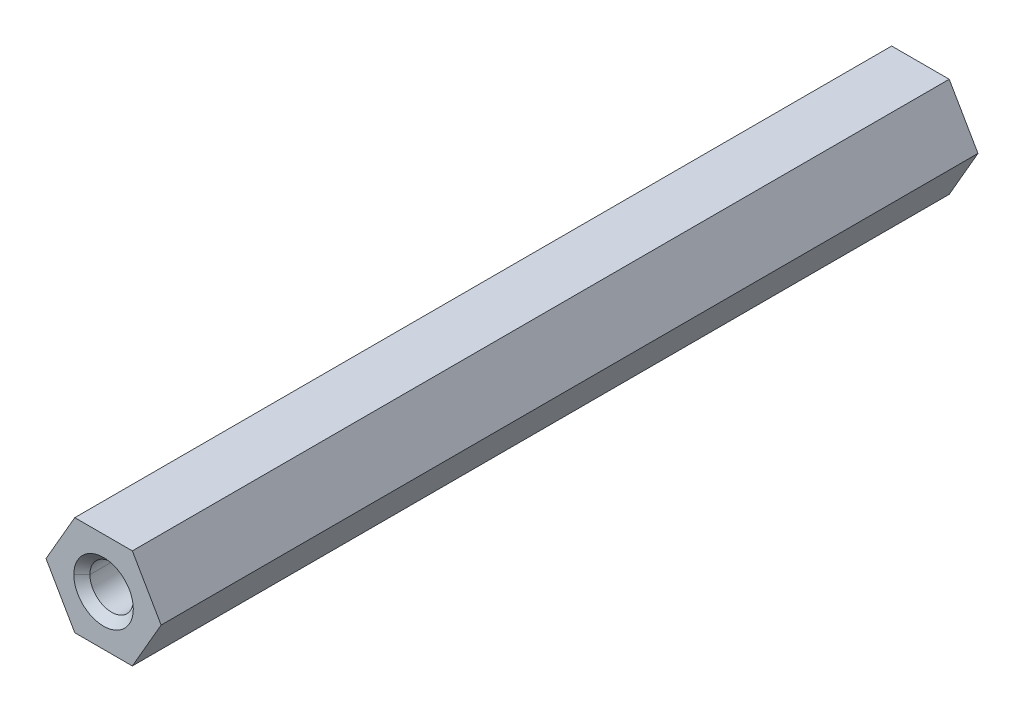
ISO-10303-21;
HEADER;
FILE_DESCRIPTION(('STEP AP214'),'2;1');
FILE_NAME('part.step','',(''),(''),'','','');
FILE_SCHEMA(('AUTOMOTIVE_DESIGN { 1 0 10303 214 1 1 1 1 }'));
ENDSEC;
DATA;
#1=APPLICATION_CONTEXT('core data for automotive mechanical design processes');
#2=APPLICATION_PROTOCOL_DEFINITION('international standard','automotive_design',2000,#1);
#3=PRODUCT_CONTEXT('',#1,'mechanical');
#4=PRODUCT('Part','Part','',(#3));
#5=PRODUCT_RELATED_PRODUCT_CATEGORY('part','',(#4));
#6=PRODUCT_DEFINITION_FORMATION('','',#4);
#7=PRODUCT_DEFINITION_CONTEXT('part definition',#1,'design');
#8=PRODUCT_DEFINITION('design','',#6,#7);
#9=PRODUCT_DEFINITION_SHAPE('','',#8);
#10=(LENGTH_UNIT() NAMED_UNIT(*) SI_UNIT(.MILLI.,.METRE.));
#11=(NAMED_UNIT(*) PLANE_ANGLE_UNIT() SI_UNIT($,.RADIAN.));
#12=(NAMED_UNIT(*) SI_UNIT($,.STERADIAN.) SOLID_ANGLE_UNIT());
#13=UNCERTAINTY_MEASURE_WITH_UNIT(LENGTH_MEASURE(1.E-05),#10,'distance_accuracy_value','');
#14=(GEOMETRIC_REPRESENTATION_CONTEXT(3) GLOBAL_UNCERTAINTY_ASSIGNED_CONTEXT((#13)) GLOBAL_UNIT_ASSIGNED_CONTEXT((#10,
#11,#12)) REPRESENTATION_CONTEXT('',''));
#15=CARTESIAN_POINT('',(0.,0.,0.));
#16=DIRECTION('',(0.,0.,1.));
#17=DIRECTION('',(1.,0.,0.));
#18=AXIS2_PLACEMENT_3D('',#15,#16,#17);
#19=CARTESIAN_POINT('',(-1.62454908752352,-14.8840979144325,35.8692888654536));
#20=DIRECTION('',(0.,0.,1.));
#21=DIRECTION('',(1.,0.,0.));
#22=AXIS2_PLACEMENT_3D('',#19,#20,#21);
#23=CONICAL_SURFACE('',#22,1.35,0.785398163397452);
#24=DIRECTION('',(-0.707106781186551,0.,0.707106781186545));
#25=VECTOR('',#24,1.);
#26=CARTESIAN_POINT('',(-2.97454908752352,-14.8840979144325,35.8692888654536));
#27=LINE('',#26,#25);
#28=CARTESIAN_POINT('',(-2.97454908752352,-14.8840979144325,35.8692888654536));
#29=VERTEX_POINT('',#28);
#30=CARTESIAN_POINT('',(-3.47454908752353,-14.8840979144325,36.3692888654536));
#31=VERTEX_POINT('',#30);
#32=EDGE_CURVE('E236',#29,#31,#27,.T.);
#33=ORIENTED_EDGE('',*,*,#32,.F.);
#34=CARTESIAN_POINT('',(-1.62454908752352,-14.8840979144325,35.8692888654536));
#35=DIRECTION('',(0.,0.,1.));
#36=DIRECTION('',(-1.,0.,0.));
#37=AXIS2_PLACEMENT_3D('',#34,#35,#36);
#38=CIRCLE('',#37,1.35);
#39=CARTESIAN_POINT('',(-0.274549087523519,-14.8840979144325,35.8692888654536));
#40=VERTEX_POINT('',#39);
#41=EDGE_CURVE('E9',#40,#29,#38,.T.);
#42=ORIENTED_EDGE('',*,*,#41,.F.);
#43=DIRECTION('',(0.707106781186551,0.,0.707106781186545));
#44=VECTOR('',#43,1.);
#45=CARTESIAN_POINT('',(-0.274549087523519,-14.8840979144325,35.8692888654536));
#46=LINE('',#45,#44);
#47=CARTESIAN_POINT('',(0.225450912476485,-14.8840979144325,36.3692888654536));
#48=VERTEX_POINT('',#47);
#49=EDGE_CURVE('E179',#40,#48,#46,.T.);
#50=ORIENTED_EDGE('',*,*,#49,.T.);
#51=CARTESIAN_POINT('',(-1.62454908752352,-14.8840979144325,36.3692888654536));
#52=DIRECTION('',(0.,0.,-1.));
#53=DIRECTION('',(-1.,0.,0.));
#54=AXIS2_PLACEMENT_3D('',#51,#52,#53);
#55=CIRCLE('',#54,1.85);
#56=EDGE_CURVE('E160',#31,#48,#55,.T.);
#57=ORIENTED_EDGE('',*,*,#56,.F.);
#58=EDGE_LOOP('',(#33,#42,#50,#57));
#59=FACE_BOUND('',#58,.T.);
#60=ADVANCED_FACE('F14',(#59),#23,.F.);
#61=CARTESIAN_POINT('',(-1.62454908752352,-14.8840979144325,-14.4307111345464));
#62=DIRECTION('',(0.,0.,-1.));
#63=DIRECTION('',(-1.,0.,0.));
#64=AXIS2_PLACEMENT_3D('',#61,#62,#63);
#65=CONICAL_SURFACE('',#64,1.85,0.785398163397445);
#66=DIRECTION('',(0.707106781186545,0.,-0.70710678118655));
#67=VECTOR('',#66,1.);
#68=CARTESIAN_POINT('',(0.225450912476485,-14.8840979144325,-14.4307111345464));
#69=LINE('',#68,#67);
#70=CARTESIAN_POINT('',(-0.274549087523519,-14.8840979144325,-13.9307111345464));
#71=VERTEX_POINT('',#70);
#72=CARTESIAN_POINT('',(0.225450912476485,-14.8840979144325,-14.4307111345464));
#73=VERTEX_POINT('',#72);
#74=EDGE_CURVE('E154',#71,#73,#69,.T.);
#75=ORIENTED_EDGE('',*,*,#74,.F.);
#76=CARTESIAN_POINT('',(-1.62454908752352,-14.8840979144325,-13.9307111345464));
#77=DIRECTION('',(0.,0.,-1.));
#78=DIRECTION('',(-1.,0.,0.));
#79=AXIS2_PLACEMENT_3D('',#76,#77,#78);
#80=CIRCLE('',#79,1.35);
#81=CARTESIAN_POINT('',(-2.97454908752352,-14.8840979144325,-13.9307111345464));
#82=VERTEX_POINT('',#81);
#83=EDGE_CURVE('E25',#82,#71,#80,.T.);
#84=ORIENTED_EDGE('',*,*,#83,.F.);
#85=DIRECTION('',(-0.707106781186545,0.,-0.70710678118655));
#86=VECTOR('',#85,1.);
#87=CARTESIAN_POINT('',(-3.47454908752353,-14.8840979144325,-14.4307111345464));
#88=LINE('',#87,#86);
#89=CARTESIAN_POINT('',(-3.47454908752353,-14.8840979144325,-14.4307111345464));
#90=VERTEX_POINT('',#89);
#91=EDGE_CURVE('E151',#82,#90,#88,.T.);
#92=ORIENTED_EDGE('',*,*,#91,.T.);
#93=CARTESIAN_POINT('',(-1.62454908752352,-14.8840979144325,-14.4307111345464));
#94=DIRECTION('',(0.,0.,1.));
#95=DIRECTION('',(-1.,0.,0.));
#96=AXIS2_PLACEMENT_3D('',#93,#94,#95);
#97=CIRCLE('',#96,1.85);
#98=EDGE_CURVE('E143',#73,#90,#97,.T.);
#99=ORIENTED_EDGE('',*,*,#98,.F.);
#100=EDGE_LOOP('',(#75,#84,#92,#99));
#101=FACE_BOUND('',#100,.T.);
#102=ADVANCED_FACE('F149',(#101),#65,.F.);
#103=CARTESIAN_POINT('',(-1.62454908752352,-14.8840979144325,-14.4307111345464));
#104=DIRECTION('',(0.,0.,1.));
#105=DIRECTION('',(1.,0.,0.));
#106=AXIS2_PLACEMENT_3D('',#103,#104,#105);
#107=CYLINDRICAL_SURFACE('',#106,1.35);
#108=DIRECTION('',(0.,0.,1.));
#109=VECTOR('',#108,1.);
#110=CARTESIAN_POINT('',(-2.97454908752352,-14.8840979144325,-14.4307111345464));
#111=LINE('',#110,#109);
#112=EDGE_CURVE('E163',#82,#29,#111,.T.);
#113=ORIENTED_EDGE('',*,*,#112,.F.);
#114=ORIENTED_EDGE('',*,*,#83,.T.);
#115=DIRECTION('',(0.,0.,1.));
#116=VECTOR('',#115,1.);
#117=CARTESIAN_POINT('',(-0.274549087523519,-14.8840979144325,-14.4307111345464));
#118=LINE('',#117,#116);
#119=EDGE_CURVE('E169',#71,#40,#118,.T.);
#120=ORIENTED_EDGE('',*,*,#119,.T.);
#121=ORIENTED_EDGE('',*,*,#41,.T.);
#122=EDGE_LOOP('',(#113,#114,#120,#121));
#123=FACE_BOUND('',#122,.T.);
#124=ADVANCED_FACE('F16',(#123),#107,.F.);
#125=CARTESIAN_POINT('',(-1.62454908752352,-21.0840979144324,36.3692888654536));
#126=DIRECTION('',(0.,0.,-1.));
#127=DIRECTION('',(0.,-1.,0.));
#128=AXIS2_PLACEMENT_3D('',#125,#126,#127);
#129=PLANE('',#128);
#130=CARTESIAN_POINT('',(-1.62454908752352,-14.8840979144325,36.3692888654536));
#131=DIRECTION('',(0.,0.,-1.));
#132=DIRECTION('',(-1.,0.,0.));
#133=AXIS2_PLACEMENT_3D('',#130,#131,#132);
#134=CIRCLE('',#133,1.85);
#135=EDGE_CURVE('E188',#48,#31,#134,.T.);
#136=ORIENTED_EDGE('',*,*,#135,.T.);
#137=ORIENTED_EDGE('',*,*,#56,.T.);
#138=EDGE_LOOP('',(#136,#137));
#139=FACE_BOUND('',#138,.T.);
#140=DIRECTION('',(0.5,0.866025403784439,0.));
#141=VECTOR('',#140,1.);
#142=CARTESIAN_POINT('',(0.165236746964321,-17.9840979144324,36.3692888654536));
#143=LINE('',#142,#141);
#144=CARTESIAN_POINT('',(0.165236746964321,-17.9840979144324,36.3692888654536));
#145=VERTEX_POINT('',#144);
#146=CARTESIAN_POINT('',(1.95502258145217,-14.8840979144325,36.3692888654536));
#147=VERTEX_POINT('',#146);
#148=EDGE_CURVE('E232',#145,#147,#143,.T.);
#149=ORIENTED_EDGE('',*,*,#148,.T.);
#150=DIRECTION('',(-0.5,0.866025403784439,0.));
#151=VECTOR('',#150,1.);
#152=CARTESIAN_POINT('',(1.95502258145217,-14.8840979144325,36.3692888654536));
#153=LINE('',#152,#151);
#154=CARTESIAN_POINT('',(0.165236746964321,-11.7840979144325,36.3692888654536));
#155=VERTEX_POINT('',#154);
#156=EDGE_CURVE('E250',#147,#155,#153,.T.);
#157=ORIENTED_EDGE('',*,*,#156,.T.);
#158=DIRECTION('',(-1.,0.,0.));
#159=VECTOR('',#158,1.);
#160=CARTESIAN_POINT('',(0.165236746964321,-11.7840979144325,36.3692888654536));
#161=LINE('',#160,#159);
#162=CARTESIAN_POINT('',(-3.41433492201136,-11.7840979144325,36.3692888654536));
#163=VERTEX_POINT('',#162);
#164=EDGE_CURVE('E111',#155,#163,#161,.T.);
#165=ORIENTED_EDGE('',*,*,#164,.T.);
#166=DIRECTION('',(-0.5,-0.866025403784439,0.));
#167=VECTOR('',#166,1.);
#168=CARTESIAN_POINT('',(-3.41433492201136,-11.7840979144325,36.3692888654536));
#169=LINE('',#168,#167);
#170=CARTESIAN_POINT('',(-5.2041207564992,-14.8840979144325,36.3692888654536));
#171=VERTEX_POINT('',#170);
#172=EDGE_CURVE('E127',#163,#171,#169,.T.);
#173=ORIENTED_EDGE('',*,*,#172,.T.);
#174=DIRECTION('',(0.5,-0.866025403784439,0.));
#175=VECTOR('',#174,1.);
#176=CARTESIAN_POINT('',(-5.2041207564992,-14.8840979144325,36.3692888654536));
#177=LINE('',#176,#175);
#178=CARTESIAN_POINT('',(-3.41433492201136,-17.9840979144324,36.3692888654536));
#179=VERTEX_POINT('',#178);
#180=EDGE_CURVE('E216',#171,#179,#177,.T.);
#181=ORIENTED_EDGE('',*,*,#180,.T.);
#182=DIRECTION('',(1.,0.,0.));
#183=VECTOR('',#182,1.);
#184=CARTESIAN_POINT('',(-3.41433492201136,-17.9840979144324,36.3692888654536));
#185=LINE('',#184,#183);
#186=EDGE_CURVE('E198',#179,#145,#185,.T.);
#187=ORIENTED_EDGE('',*,*,#186,.T.);
#188=EDGE_LOOP('',(#149,#157,#165,#173,#181,#187));
#189=FACE_BOUND('',#188,.T.);
#190=ADVANCED_FACE('F311',(#139,#189),#129,.F.);
#191=CARTESIAN_POINT('',(-1.62454908752352,-21.0840979144324,-14.4307111345464));
#192=DIRECTION('',(0.,0.,-1.));
#193=DIRECTION('',(0.,-1.,0.));
#194=AXIS2_PLACEMENT_3D('',#191,#192,#193);
#195=PLANE('',#194);
#196=CARTESIAN_POINT('',(-1.62454908752352,-14.8840979144325,-14.4307111345464));
#197=DIRECTION('',(0.,0.,1.));
#198=DIRECTION('',(-1.,0.,0.));
#199=AXIS2_PLACEMENT_3D('',#196,#197,#198);
#200=CIRCLE('',#199,1.85);
#201=EDGE_CURVE('E174',#90,#73,#200,.T.);
#202=ORIENTED_EDGE('',*,*,#201,.T.);
#203=ORIENTED_EDGE('',*,*,#98,.T.);
#204=EDGE_LOOP('',(#202,#203));
#205=FACE_BOUND('',#204,.T.);
#206=DIRECTION('',(0.5,0.866025403784439,0.));
#207=VECTOR('',#206,1.);
#208=CARTESIAN_POINT('',(0.165236746964321,-17.9840979144324,-14.4307111345464));
#209=LINE('',#208,#207);
#210=CARTESIAN_POINT('',(0.165236746964321,-17.9840979144324,-14.4307111345464));
#211=VERTEX_POINT('',#210);
#212=CARTESIAN_POINT('',(1.95502258145217,-14.8840979144325,-14.4307111345464));
#213=VERTEX_POINT('',#212);
#214=EDGE_CURVE('E201',#211,#213,#209,.T.);
#215=ORIENTED_EDGE('',*,*,#214,.F.);
#216=DIRECTION('',(1.,0.,0.));
#217=VECTOR('',#216,1.);
#218=CARTESIAN_POINT('',(-3.41433492201136,-17.9840979144324,-14.4307111345464));
#219=LINE('',#218,#217);
#220=CARTESIAN_POINT('',(-3.41433492201136,-17.9840979144324,-14.4307111345464));
#221=VERTEX_POINT('',#220);
#222=EDGE_CURVE('E96',#221,#211,#219,.T.);
#223=ORIENTED_EDGE('',*,*,#222,.F.);
#224=DIRECTION('',(0.5,-0.866025403784439,0.));
#225=VECTOR('',#224,1.);
#226=CARTESIAN_POINT('',(-5.2041207564992,-14.8840979144325,-14.4307111345464));
#227=LINE('',#226,#225);
#228=CARTESIAN_POINT('',(-5.2041207564992,-14.8840979144325,-14.4307111345464));
#229=VERTEX_POINT('',#228);
#230=EDGE_CURVE('E206',#229,#221,#227,.T.);
#231=ORIENTED_EDGE('',*,*,#230,.F.);
#232=DIRECTION('',(-0.5,-0.866025403784439,0.));
#233=VECTOR('',#232,1.);
#234=CARTESIAN_POINT('',(-3.41433492201136,-11.7840979144325,-14.4307111345464));
#235=LINE('',#234,#233);
#236=CARTESIAN_POINT('',(-3.41433492201136,-11.7840979144325,-14.4307111345464));
#237=VERTEX_POINT('',#236);
#238=EDGE_CURVE('E121',#237,#229,#235,.T.);
#239=ORIENTED_EDGE('',*,*,#238,.F.);
#240=DIRECTION('',(-1.,0.,0.));
#241=VECTOR('',#240,1.);
#242=CARTESIAN_POINT('',(0.165236746964321,-11.7840979144325,-14.4307111345464));
#243=LINE('',#242,#241);
#244=CARTESIAN_POINT('',(0.165236746964321,-11.7840979144325,-14.4307111345464));
#245=VERTEX_POINT('',#244);
#246=EDGE_CURVE('E252',#245,#237,#243,.T.);
#247=ORIENTED_EDGE('',*,*,#246,.F.);
#248=DIRECTION('',(-0.5,0.866025403784439,0.));
#249=VECTOR('',#248,1.);
#250=CARTESIAN_POINT('',(1.95502258145217,-14.8840979144325,-14.4307111345464));
#251=LINE('',#250,#249);
#252=EDGE_CURVE('E18',#213,#245,#251,.T.);
#253=ORIENTED_EDGE('',*,*,#252,.F.);
#254=EDGE_LOOP('',(#215,#223,#231,#239,#247,#253));
#255=FACE_BOUND('',#254,.T.);
#256=ADVANCED_FACE('F300',(#205,#255),#195,.T.);
#257=CARTESIAN_POINT('',(1.95502258145217,-14.8840979144325,-14.4307111345464));
#258=DIRECTION('',(0.866025403784439,0.5,0.));
#259=DIRECTION('',(0.,0.,-1.));
#260=AXIS2_PLACEMENT_3D('',#257,#258,#259);
#261=PLANE('',#260);
#262=ORIENTED_EDGE('',*,*,#156,.F.);
#263=DIRECTION('',(0.,0.,1.));
#264=VECTOR('',#263,1.);
#265=CARTESIAN_POINT('',(1.95502258145217,-14.8840979144325,-14.4307111345464));
#266=LINE('',#265,#264);
#267=EDGE_CURVE('E191',#213,#147,#266,.T.);
#268=ORIENTED_EDGE('',*,*,#267,.F.);
#269=ORIENTED_EDGE('',*,*,#252,.T.);
#270=DIRECTION('',(0.,0.,1.));
#271=VECTOR('',#270,1.);
#272=CARTESIAN_POINT('',(0.165236746964321,-11.7840979144325,-14.4307111345464));
#273=LINE('',#272,#271);
#274=EDGE_CURVE('E249',#245,#155,#273,.T.);
#275=ORIENTED_EDGE('',*,*,#274,.T.);
#276=EDGE_LOOP('',(#262,#268,#269,#275));
#277=FACE_BOUND('',#276,.T.);
#278=ADVANCED_FACE('F265',(#277),#261,.T.);
#279=CARTESIAN_POINT('',(0.165236746964321,-11.7840979144325,-14.4307111345464));
#280=DIRECTION('',(0.,1.,0.));
#281=DIRECTION('',(1.,0.,0.));
#282=AXIS2_PLACEMENT_3D('',#279,#280,#281);
#283=PLANE('',#282);
#284=ORIENTED_EDGE('',*,*,#164,.F.);
#285=ORIENTED_EDGE('',*,*,#274,.F.);
#286=ORIENTED_EDGE('',*,*,#246,.T.);
#287=DIRECTION('',(0.,0.,1.));
#288=VECTOR('',#287,1.);
#289=CARTESIAN_POINT('',(-3.41433492201136,-11.7840979144325,-14.4307111345464));
#290=LINE('',#289,#288);
#291=EDGE_CURVE('E214',#237,#163,#290,.T.);
#292=ORIENTED_EDGE('',*,*,#291,.T.);
#293=EDGE_LOOP('',(#284,#285,#286,#292));
#294=FACE_BOUND('',#293,.T.);
#295=ADVANCED_FACE('F268',(#294),#283,.T.);
#296=CARTESIAN_POINT('',(-3.41433492201136,-11.7840979144325,-14.4307111345464));
#297=DIRECTION('',(-0.866025403784439,0.5,0.));
#298=DIRECTION('',(0.,0.,1.));
#299=AXIS2_PLACEMENT_3D('',#296,#297,#298);
#300=PLANE('',#299);
#301=ORIENTED_EDGE('',*,*,#172,.F.);
#302=ORIENTED_EDGE('',*,*,#291,.F.);
#303=ORIENTED_EDGE('',*,*,#238,.T.);
#304=DIRECTION('',(0.,0.,1.));
#305=VECTOR('',#304,1.);
#306=CARTESIAN_POINT('',(-5.2041207564992,-14.8840979144325,-14.4307111345464));
#307=LINE('',#306,#305);
#308=EDGE_CURVE('E209',#229,#171,#307,.T.);
#309=ORIENTED_EDGE('',*,*,#308,.T.);
#310=EDGE_LOOP('',(#301,#302,#303,#309));
#311=FACE_BOUND('',#310,.T.);
#312=ADVANCED_FACE('F269',(#311),#300,.T.);
#313=CARTESIAN_POINT('',(-5.2041207564992,-14.8840979144325,-14.4307111345464));
#314=DIRECTION('',(-0.866025403784439,-0.5,0.));
#315=DIRECTION('',(-0.5,0.866025403784439,0.));
#316=AXIS2_PLACEMENT_3D('',#313,#314,#315);
#317=PLANE('',#316);
#318=ORIENTED_EDGE('',*,*,#180,.F.);
#319=ORIENTED_EDGE('',*,*,#308,.F.);
#320=ORIENTED_EDGE('',*,*,#230,.T.);
#321=DIRECTION('',(0.,0.,1.));
#322=VECTOR('',#321,1.);
#323=CARTESIAN_POINT('',(-3.41433492201136,-17.9840979144324,-14.4307111345464));
#324=LINE('',#323,#322);
#325=EDGE_CURVE('E194',#221,#179,#324,.T.);
#326=ORIENTED_EDGE('',*,*,#325,.T.);
#327=EDGE_LOOP('',(#318,#319,#320,#326));
#328=FACE_BOUND('',#327,.T.);
#329=ADVANCED_FACE('F271',(#328),#317,.T.);
#330=CARTESIAN_POINT('',(-3.41433492201136,-17.9840979144324,-14.4307111345464));
#331=DIRECTION('',(0.,-1.,0.));
#332=DIRECTION('',(0.,0.,-1.));
#333=AXIS2_PLACEMENT_3D('',#330,#331,#332);
#334=PLANE('',#333);
#335=ORIENTED_EDGE('',*,*,#186,.F.);
#336=ORIENTED_EDGE('',*,*,#325,.F.);
#337=ORIENTED_EDGE('',*,*,#222,.T.);
#338=DIRECTION('',(0.,0.,1.));
#339=VECTOR('',#338,1.);
#340=CARTESIAN_POINT('',(0.165236746964321,-17.9840979144324,-14.4307111345464));
#341=LINE('',#340,#339);
#342=EDGE_CURVE('E205',#211,#145,#341,.T.);
#343=ORIENTED_EDGE('',*,*,#342,.T.);
#344=EDGE_LOOP('',(#335,#336,#337,#343));
#345=FACE_BOUND('',#344,.T.);
#346=ADVANCED_FACE('F278',(#345),#334,.T.);
#347=CARTESIAN_POINT('',(0.165236746964321,-17.9840979144324,-14.4307111345464));
#348=DIRECTION('',(0.866025403784439,-0.5,0.));
#349=DIRECTION('',(0.,0.,-1.));
#350=AXIS2_PLACEMENT_3D('',#347,#348,#349);
#351=PLANE('',#350);
#352=ORIENTED_EDGE('',*,*,#148,.F.);
#353=ORIENTED_EDGE('',*,*,#342,.F.);
#354=ORIENTED_EDGE('',*,*,#214,.T.);
#355=ORIENTED_EDGE('',*,*,#267,.T.);
#356=EDGE_LOOP('',(#352,#353,#354,#355));
#357=FACE_BOUND('',#356,.T.);
#358=ADVANCED_FACE('F292',(#357),#351,.T.);
#359=CARTESIAN_POINT('',(-1.62454908752352,-14.8840979144325,-14.4307111345464));
#360=DIRECTION('',(0.,0.,1.));
#361=DIRECTION('',(1.,0.,0.));
#362=AXIS2_PLACEMENT_3D('',#359,#360,#361);
#363=CYLINDRICAL_SURFACE('',#362,1.35);
#364=CARTESIAN_POINT('',(-1.62454908752352,-14.8840979144325,-13.9307111345464));
#365=DIRECTION('',(0.,0.,-1.));
#366=DIRECTION('',(-1.,0.,0.));
#367=AXIS2_PLACEMENT_3D('',#364,#365,#366);
#368=CIRCLE('',#367,1.35);
#369=EDGE_CURVE('E173',#71,#82,#368,.T.);
#370=ORIENTED_EDGE('',*,*,#369,.T.);
#371=ORIENTED_EDGE('',*,*,#112,.T.);
#372=CARTESIAN_POINT('',(-1.62454908752352,-14.8840979144325,35.8692888654536));
#373=DIRECTION('',(0.,0.,1.));
#374=DIRECTION('',(-1.,0.,0.));
#375=AXIS2_PLACEMENT_3D('',#372,#373,#374);
#376=CIRCLE('',#375,1.35);
#377=EDGE_CURVE('E240',#29,#40,#376,.T.);
#378=ORIENTED_EDGE('',*,*,#377,.T.);
#379=ORIENTED_EDGE('',*,*,#119,.F.);
#380=EDGE_LOOP('',(#370,#371,#378,#379));
#381=FACE_BOUND('',#380,.T.);
#382=ADVANCED_FACE('F177',(#381),#363,.F.);
#383=CARTESIAN_POINT('',(-1.62454908752352,-14.8840979144325,-14.4307111345464));
#384=DIRECTION('',(0.,0.,-1.));
#385=DIRECTION('',(-1.,0.,0.));
#386=AXIS2_PLACEMENT_3D('',#383,#384,#385);
#387=CONICAL_SURFACE('',#386,1.85,0.785398163397445);
#388=ORIENTED_EDGE('',*,*,#369,.F.);
#389=ORIENTED_EDGE('',*,*,#74,.T.);
#390=ORIENTED_EDGE('',*,*,#201,.F.);
#391=ORIENTED_EDGE('',*,*,#91,.F.);
#392=EDGE_LOOP('',(#388,#389,#390,#391));
#393=FACE_BOUND('',#392,.T.);
#394=ADVANCED_FACE('F172',(#393),#387,.F.);
#395=CARTESIAN_POINT('',(-1.62454908752352,-14.8840979144325,35.8692888654536));
#396=DIRECTION('',(0.,0.,1.));
#397=DIRECTION('',(1.,0.,0.));
#398=AXIS2_PLACEMENT_3D('',#395,#396,#397);
#399=CONICAL_SURFACE('',#398,1.35,0.785398163397452);
#400=ORIENTED_EDGE('',*,*,#377,.F.);
#401=ORIENTED_EDGE('',*,*,#32,.T.);
#402=ORIENTED_EDGE('',*,*,#135,.F.);
#403=ORIENTED_EDGE('',*,*,#49,.F.);
#404=EDGE_LOOP('',(#400,#401,#402,#403));
#405=FACE_BOUND('',#404,.T.);
#406=ADVANCED_FACE('F302',(#405),#399,.F.);
#407=CLOSED_SHELL('',(#60,#102,#124,#190,#256,#278,#295,#312,#329,#346,#358,#382,#394,#406));
#408=MANIFOLD_SOLID_BREP('B1',#407);
#409=ADVANCED_BREP_SHAPE_REPRESENTATION('',(#18,#408),#14);
#410=SHAPE_DEFINITION_REPRESENTATION(#9,#409);
ENDSEC;
END-ISO-10303-21;
